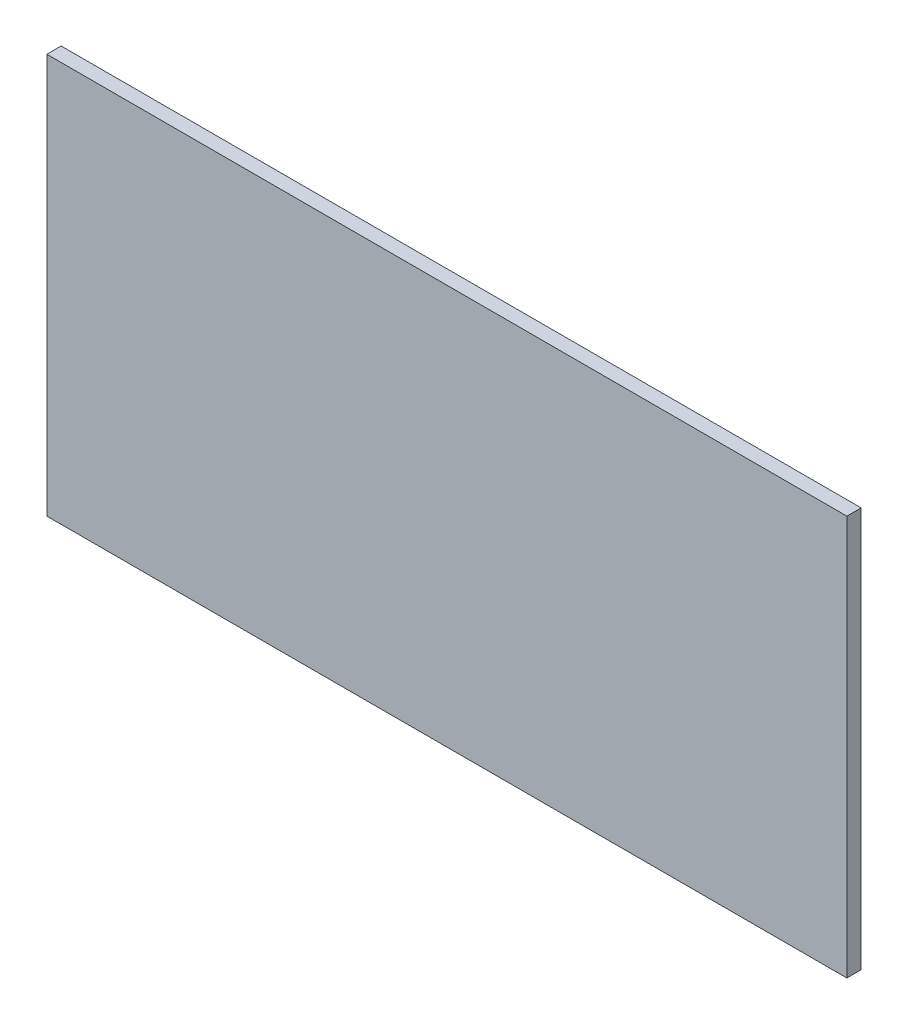
ISO-10303-21;
HEADER;
FILE_DESCRIPTION(('STEP AP214'),'2;1');
FILE_NAME('part.step','',(''),(''),'','','');
FILE_SCHEMA(('AUTOMOTIVE_DESIGN { 1 0 10303 214 1 1 1 1 }'));
ENDSEC;
DATA;
#1=APPLICATION_CONTEXT('core data for automotive mechanical design processes');
#2=APPLICATION_PROTOCOL_DEFINITION('international standard','automotive_design',2000,#1);
#3=PRODUCT_CONTEXT('',#1,'mechanical');
#4=PRODUCT('Part','Part','',(#3));
#5=PRODUCT_RELATED_PRODUCT_CATEGORY('part','',(#4));
#6=PRODUCT_DEFINITION_FORMATION('','',#4);
#7=PRODUCT_DEFINITION_CONTEXT('part definition',#1,'design');
#8=PRODUCT_DEFINITION('design','',#6,#7);
#9=PRODUCT_DEFINITION_SHAPE('','',#8);
#10=(LENGTH_UNIT() NAMED_UNIT(*) SI_UNIT(.MILLI.,.METRE.));
#11=(NAMED_UNIT(*) PLANE_ANGLE_UNIT() SI_UNIT($,.RADIAN.));
#12=(NAMED_UNIT(*) SI_UNIT($,.STERADIAN.) SOLID_ANGLE_UNIT());
#13=UNCERTAINTY_MEASURE_WITH_UNIT(LENGTH_MEASURE(1.E-05),#10,'distance_accuracy_value','');
#14=(GEOMETRIC_REPRESENTATION_CONTEXT(3) GLOBAL_UNCERTAINTY_ASSIGNED_CONTEXT((#13)) GLOBAL_UNIT_ASSIGNED_CONTEXT((#10,
#11,#12)) REPRESENTATION_CONTEXT('',''));
#15=CARTESIAN_POINT('',(0.,0.,0.));
#16=DIRECTION('',(0.,0.,1.));
#17=DIRECTION('',(1.,0.,0.));
#18=AXIS2_PLACEMENT_3D('',#15,#16,#17);
#19=CARTESIAN_POINT('',(0.,0.,25.));
#20=DIRECTION('',(1.,0.,0.));
#21=DIRECTION('',(0.,0.,-1.));
#22=AXIS2_PLACEMENT_3D('',#19,#20,#21);
#23=PLANE('',#22);
#24=DIRECTION('',(0.,-1.,0.));
#25=VECTOR('',#24,1.);
#26=CARTESIAN_POINT('',(0.,0.,0.));
#27=LINE('',#26,#25);
#28=CARTESIAN_POINT('',(0.,700.,0.));
#29=VERTEX_POINT('',#28);
#30=CARTESIAN_POINT('',(0.,0.,0.));
#31=VERTEX_POINT('',#30);
#32=EDGE_CURVE('E96',#29,#31,#27,.T.);
#33=ORIENTED_EDGE('',*,*,#32,.T.);
#34=DIRECTION('',(0.,0.,-1.));
#35=VECTOR('',#34,1.);
#36=CARTESIAN_POINT('',(0.,0.,25.));
#37=LINE('',#36,#35);
#38=CARTESIAN_POINT('',(0.,0.,25.));
#39=VERTEX_POINT('',#38);
#40=EDGE_CURVE('E11',#39,#31,#37,.T.);
#41=ORIENTED_EDGE('',*,*,#40,.F.);
#42=DIRECTION('',(0.,-1.,0.));
#43=VECTOR('',#42,1.);
#44=CARTESIAN_POINT('',(0.,0.,25.));
#45=LINE('',#44,#43);
#46=CARTESIAN_POINT('',(0.,700.,25.));
#47=VERTEX_POINT('',#46);
#48=EDGE_CURVE('E84',#47,#39,#45,.T.);
#49=ORIENTED_EDGE('',*,*,#48,.F.);
#50=DIRECTION('',(0.,0.,-1.));
#51=VECTOR('',#50,1.);
#52=CARTESIAN_POINT('',(0.,700.,25.));
#53=LINE('',#52,#51);
#54=EDGE_CURVE('E92',#47,#29,#53,.T.);
#55=ORIENTED_EDGE('',*,*,#54,.T.);
#56=EDGE_LOOP('',(#33,#41,#49,#55));
#57=FACE_BOUND('',#56,.T.);
#58=ADVANCED_FACE('F33',(#57),#23,.F.);
#59=CARTESIAN_POINT('',(0.,0.,25.));
#60=DIRECTION('',(0.,1.,0.));
#61=DIRECTION('',(0.,0.,1.));
#62=AXIS2_PLACEMENT_3D('',#59,#60,#61);
#63=PLANE('',#62);
#64=DIRECTION('',(1.,0.,0.));
#65=VECTOR('',#64,1.);
#66=CARTESIAN_POINT('',(0.,0.,0.));
#67=LINE('',#66,#65);
#68=CARTESIAN_POINT('',(1400.,0.,0.));
#69=VERTEX_POINT('',#68);
#70=EDGE_CURVE('E88',#31,#69,#67,.T.);
#71=ORIENTED_EDGE('',*,*,#70,.T.);
#72=DIRECTION('',(0.,0.,-1.));
#73=VECTOR('',#72,1.);
#74=CARTESIAN_POINT('',(1400.,0.,25.));
#75=LINE('',#74,#73);
#76=CARTESIAN_POINT('',(1400.,0.,25.));
#77=VERTEX_POINT('',#76);
#78=EDGE_CURVE('E41',#77,#69,#75,.T.);
#79=ORIENTED_EDGE('',*,*,#78,.F.);
#80=DIRECTION('',(1.,0.,0.));
#81=VECTOR('',#80,1.);
#82=CARTESIAN_POINT('',(0.,0.,25.));
#83=LINE('',#82,#81);
#84=EDGE_CURVE('E79',#39,#77,#83,.T.);
#85=ORIENTED_EDGE('',*,*,#84,.F.);
#86=ORIENTED_EDGE('',*,*,#40,.T.);
#87=EDGE_LOOP('',(#71,#79,#85,#86));
#88=FACE_BOUND('',#87,.T.);
#89=ADVANCED_FACE('F87',(#88),#63,.F.);
#90=CARTESIAN_POINT('',(1400.,0.,25.));
#91=DIRECTION('',(-1.,0.,0.));
#92=DIRECTION('',(0.,0.,1.));
#93=AXIS2_PLACEMENT_3D('',#90,#91,#92);
#94=PLANE('',#93);
#95=DIRECTION('',(0.,1.,0.));
#96=VECTOR('',#95,1.);
#97=CARTESIAN_POINT('',(1400.,0.,0.));
#98=LINE('',#97,#96);
#99=CARTESIAN_POINT('',(1400.,700.,0.));
#100=VERTEX_POINT('',#99);
#101=EDGE_CURVE('E66',#69,#100,#98,.T.);
#102=ORIENTED_EDGE('',*,*,#101,.T.);
#103=DIRECTION('',(0.,0.,-1.));
#104=VECTOR('',#103,1.);
#105=CARTESIAN_POINT('',(1400.,700.,25.));
#106=LINE('',#105,#104);
#107=CARTESIAN_POINT('',(1400.,700.,25.));
#108=VERTEX_POINT('',#107);
#109=EDGE_CURVE('E89',#108,#100,#106,.T.);
#110=ORIENTED_EDGE('',*,*,#109,.F.);
#111=DIRECTION('',(0.,1.,0.));
#112=VECTOR('',#111,1.);
#113=CARTESIAN_POINT('',(1400.,0.,25.));
#114=LINE('',#113,#112);
#115=EDGE_CURVE('E82',#77,#108,#114,.T.);
#116=ORIENTED_EDGE('',*,*,#115,.F.);
#117=ORIENTED_EDGE('',*,*,#78,.T.);
#118=EDGE_LOOP('',(#102,#110,#116,#117));
#119=FACE_BOUND('',#118,.T.);
#120=ADVANCED_FACE('F90',(#119),#94,.F.);
#121=CARTESIAN_POINT('',(0.,700.,25.));
#122=DIRECTION('',(0.,-1.,0.));
#123=DIRECTION('',(0.,0.,-1.));
#124=AXIS2_PLACEMENT_3D('',#121,#122,#123);
#125=PLANE('',#124);
#126=DIRECTION('',(-1.,0.,0.));
#127=VECTOR('',#126,1.);
#128=CARTESIAN_POINT('',(0.,700.,0.));
#129=LINE('',#128,#127);
#130=EDGE_CURVE('E72',#100,#29,#129,.T.);
#131=ORIENTED_EDGE('',*,*,#130,.T.);
#132=ORIENTED_EDGE('',*,*,#54,.F.);
#133=DIRECTION('',(-1.,0.,0.));
#134=VECTOR('',#133,1.);
#135=CARTESIAN_POINT('',(0.,700.,25.));
#136=LINE('',#135,#134);
#137=EDGE_CURVE('E49',#108,#47,#136,.T.);
#138=ORIENTED_EDGE('',*,*,#137,.F.);
#139=ORIENTED_EDGE('',*,*,#109,.T.);
#140=EDGE_LOOP('',(#131,#132,#138,#139));
#141=FACE_BOUND('',#140,.T.);
#142=ADVANCED_FACE('F103',(#141),#125,.F.);
#143=CARTESIAN_POINT('',(0.,0.,25.));
#144=DIRECTION('',(0.,0.,-1.));
#145=DIRECTION('',(-1.,0.,0.));
#146=AXIS2_PLACEMENT_3D('',#143,#144,#145);
#147=PLANE('',#146);
#148=ORIENTED_EDGE('',*,*,#48,.T.);
#149=ORIENTED_EDGE('',*,*,#84,.T.);
#150=ORIENTED_EDGE('',*,*,#115,.T.);
#151=ORIENTED_EDGE('',*,*,#137,.T.);
#152=EDGE_LOOP('',(#148,#149,#150,#151));
#153=FACE_BOUND('',#152,.T.);
#154=ADVANCED_FACE('F80',(#153),#147,.F.);
#155=CARTESIAN_POINT('',(0.,0.,0.));
#156=DIRECTION('',(0.,0.,-1.));
#157=DIRECTION('',(-1.,0.,0.));
#158=AXIS2_PLACEMENT_3D('',#155,#156,#157);
#159=PLANE('',#158);
#160=ORIENTED_EDGE('',*,*,#32,.F.);
#161=ORIENTED_EDGE('',*,*,#130,.F.);
#162=ORIENTED_EDGE('',*,*,#101,.F.);
#163=ORIENTED_EDGE('',*,*,#70,.F.);
#164=EDGE_LOOP('',(#160,#161,#162,#163));
#165=FACE_BOUND('',#164,.T.);
#166=ADVANCED_FACE('F106',(#165),#159,.T.);
#167=CLOSED_SHELL('',(#58,#89,#120,#142,#154,#166));
#168=MANIFOLD_SOLID_BREP('B2',#167);
#169=ADVANCED_BREP_SHAPE_REPRESENTATION('',(#18,#168),#14);
#170=SHAPE_DEFINITION_REPRESENTATION(#9,#169);
ENDSEC;
END-ISO-10303-21;
